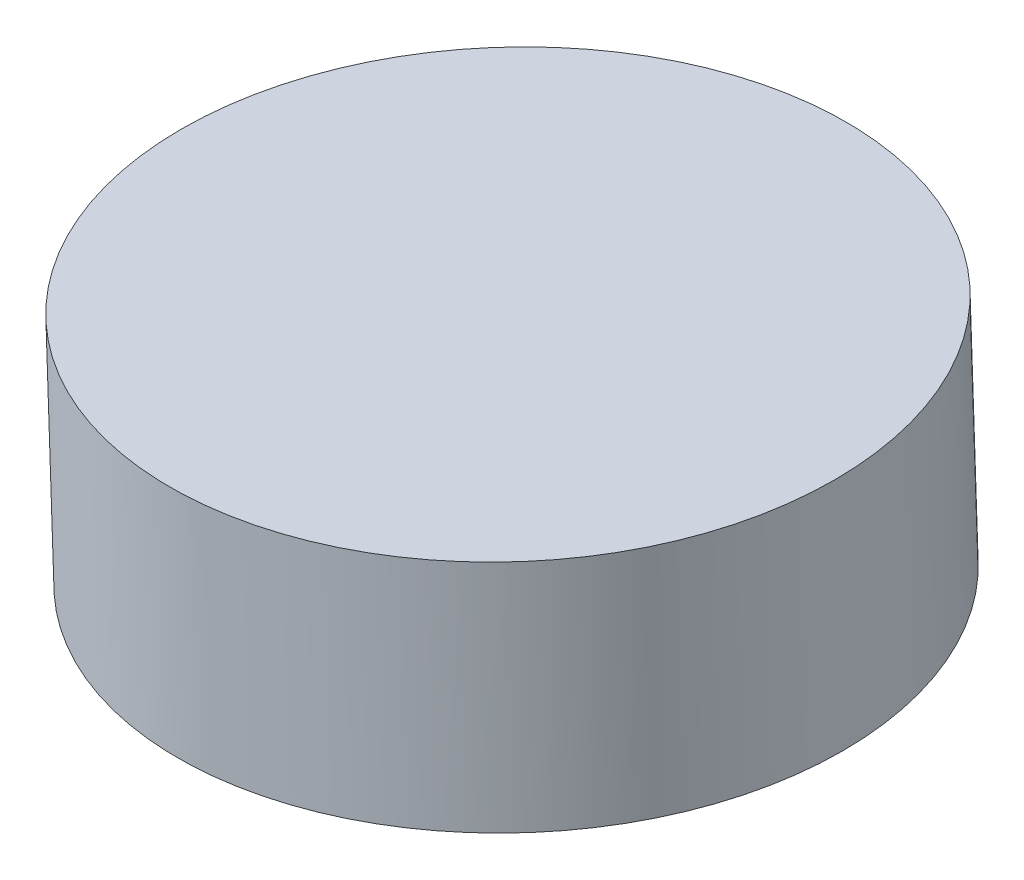
ISO-10303-21;
HEADER;
FILE_DESCRIPTION(('STEP AP214'),'2;1');
FILE_NAME('part.step','',(''),(''),'','','');
FILE_SCHEMA(('AUTOMOTIVE_DESIGN { 1 0 10303 214 1 1 1 1 }'));
ENDSEC;
DATA;
#1=APPLICATION_CONTEXT('core data for automotive mechanical design processes');
#2=APPLICATION_PROTOCOL_DEFINITION('international standard','automotive_design',2000,#1);
#3=PRODUCT_CONTEXT('',#1,'mechanical');
#4=PRODUCT('Part','Part','',(#3));
#5=PRODUCT_RELATED_PRODUCT_CATEGORY('part','',(#4));
#6=PRODUCT_DEFINITION_FORMATION('','',#4);
#7=PRODUCT_DEFINITION_CONTEXT('part definition',#1,'design');
#8=PRODUCT_DEFINITION('design','',#6,#7);
#9=PRODUCT_DEFINITION_SHAPE('','',#8);
#10=(LENGTH_UNIT() NAMED_UNIT(*) SI_UNIT(.MILLI.,.METRE.));
#11=(NAMED_UNIT(*) PLANE_ANGLE_UNIT() SI_UNIT($,.RADIAN.));
#12=(NAMED_UNIT(*) SI_UNIT($,.STERADIAN.) SOLID_ANGLE_UNIT());
#13=UNCERTAINTY_MEASURE_WITH_UNIT(LENGTH_MEASURE(1.E-05),#10,'distance_accuracy_value','');
#14=(GEOMETRIC_REPRESENTATION_CONTEXT(3) GLOBAL_UNCERTAINTY_ASSIGNED_CONTEXT((#13)) GLOBAL_UNIT_ASSIGNED_CONTEXT((#10,
#11,#12)) REPRESENTATION_CONTEXT('',''));
#15=CARTESIAN_POINT('',(0.,0.,0.));
#16=DIRECTION('',(0.,0.,1.));
#17=DIRECTION('',(1.,0.,0.));
#18=AXIS2_PLACEMENT_3D('',#15,#16,#17);
#19=CARTESIAN_POINT('',(-9.79132330967582,278.419942024281,1.20820045301063E-13));
#20=DIRECTION('',(-0.0351457375385211,0.999382197726612,0.));
#21=DIRECTION('',(-0.999382197726612,-0.0351457375385211,0.));
#22=AXIS2_PLACEMENT_3D('',#19,#20,#21);
#23=PLANE('',#22);
#24=CARTESIAN_POINT('',(-237.362932370363,270.416825637517,-370.393973925696));
#25=DIRECTION('',(-0.0351457375106092,0.999382197727594,0.));
#26=DIRECTION('',(-0.999382197727594,-0.0351457375106092,0.));
#27=AXIS2_PLACEMENT_3D('',#24,#25,#26);
#28=CIRCLE('',#27,4.25000000000002);
#29=CARTESIAN_POINT('',(-241.610306710705,270.267456253097,-370.393973925696));
#30=VERTEX_POINT('',#29);
#31=EDGE_CURVE('E45',#30,#30,#28,.T.);
#32=ORIENTED_EDGE('',*,*,#31,.F.);
#33=EDGE_LOOP('',(#32));
#34=FACE_BOUND('',#33,.T.);
#35=ADVANCED_FACE('F39',(#34),#23,.F.);
#36=CARTESIAN_POINT('',(-9.89676052220766,281.418088617463,1.24468424025279E-13));
#37=DIRECTION('',(-0.0351457375385211,0.999382197726612,0.));
#38=DIRECTION('',(-0.999382197726612,-0.0351457375385211,0.));
#39=AXIS2_PLACEMENT_3D('',#36,#37,#38);
#40=PLANE('',#39);
#41=CARTESIAN_POINT('',(-237.468369582894,273.4149722307,-370.393973925696));
#42=DIRECTION('',(-0.0351457375106092,0.999382197727594,0.));
#43=DIRECTION('',(-0.999382197727594,-0.0351457375106092,0.));
#44=AXIS2_PLACEMENT_3D('',#41,#42,#43);
#45=CIRCLE('',#44,4.25000000000002);
#46=CARTESIAN_POINT('',(-241.715743923237,273.26560284628,-370.393973925696));
#47=VERTEX_POINT('',#46);
#48=EDGE_CURVE('E11',#47,#47,#45,.T.);
#49=ORIENTED_EDGE('',*,*,#48,.T.);
#50=EDGE_LOOP('',(#49));
#51=FACE_BOUND('',#50,.T.);
#52=ADVANCED_FACE('F55',(#51),#40,.T.);
#53=CARTESIAN_POINT('',(-237.362932370363,270.416825637517,-370.393973925696));
#54=DIRECTION('',(-0.0351457375106144,0.999382197727594,0.));
#55=DIRECTION('',(-0.999382197727594,-0.0351457375106144,0.));
#56=AXIS2_PLACEMENT_3D('',#53,#54,#55);
#57=CYLINDRICAL_SURFACE('',#56,4.25000000000002);
#58=ORIENTED_EDGE('',*,*,#31,.T.);
#59=EDGE_LOOP('',(#58));
#60=FACE_BOUND('',#59,.T.);
#61=ORIENTED_EDGE('',*,*,#48,.F.);
#62=EDGE_LOOP('',(#61));
#63=FACE_BOUND('',#62,.T.);
#64=ADVANCED_FACE('F51',(#60,#63),#57,.T.);
#65=CLOSED_SHELL('',(#35,#52,#64));
#66=MANIFOLD_SOLID_BREP('B2',#65);
#67=ADVANCED_BREP_SHAPE_REPRESENTATION('',(#18,#66),#14);
#68=SHAPE_DEFINITION_REPRESENTATION(#9,#67);
ENDSEC;
END-ISO-10303-21;
